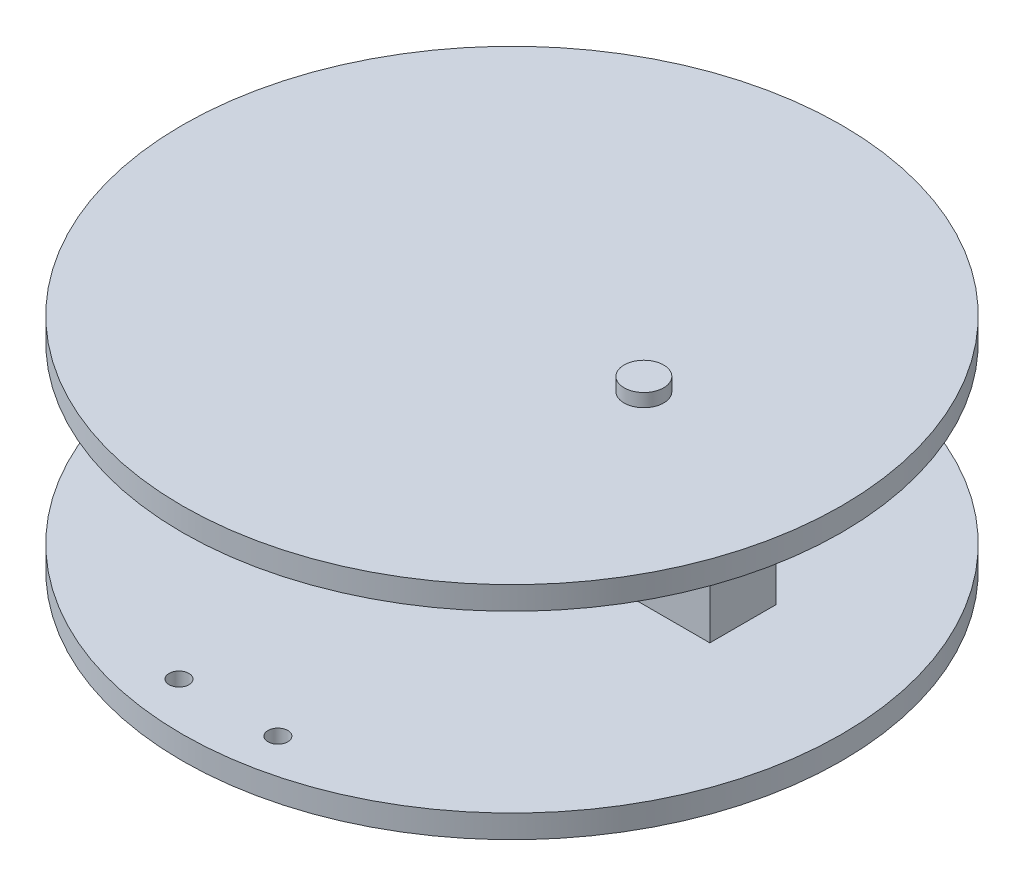
ISO-10303-21;
HEADER;
FILE_DESCRIPTION(('STEP AP214'),'2;1');
FILE_NAME('part.step','',(''),(''),'','','');
FILE_SCHEMA(('AUTOMOTIVE_DESIGN { 1 0 10303 214 1 1 1 1 }'));
ENDSEC;
DATA;
#1=APPLICATION_CONTEXT('core data for automotive mechanical design processes');
#2=APPLICATION_PROTOCOL_DEFINITION('international standard','automotive_design',2000,#1);
#3=PRODUCT_CONTEXT('',#1,'mechanical');
#4=PRODUCT('Part','Part','',(#3));
#5=PRODUCT_RELATED_PRODUCT_CATEGORY('part','',(#4));
#6=PRODUCT_DEFINITION_FORMATION('','',#4);
#7=PRODUCT_DEFINITION_CONTEXT('part definition',#1,'design');
#8=PRODUCT_DEFINITION('design','',#6,#7);
#9=PRODUCT_DEFINITION_SHAPE('','',#8);
#10=(LENGTH_UNIT() NAMED_UNIT(*) SI_UNIT(.MILLI.,.METRE.));
#11=(NAMED_UNIT(*) PLANE_ANGLE_UNIT() SI_UNIT($,.RADIAN.));
#12=(NAMED_UNIT(*) SI_UNIT($,.STERADIAN.) SOLID_ANGLE_UNIT());
#13=UNCERTAINTY_MEASURE_WITH_UNIT(LENGTH_MEASURE(1.E-05),#10,'distance_accuracy_value','');
#14=(GEOMETRIC_REPRESENTATION_CONTEXT(3) GLOBAL_UNCERTAINTY_ASSIGNED_CONTEXT((#13)) GLOBAL_UNIT_ASSIGNED_CONTEXT((#10,
#11,#12)) REPRESENTATION_CONTEXT('',''));
#15=CARTESIAN_POINT('',(0.,0.,0.));
#16=DIRECTION('',(0.,0.,1.));
#17=DIRECTION('',(1.,0.,0.));
#18=AXIS2_PLACEMENT_3D('',#15,#16,#17);
#19=CARTESIAN_POINT('',(35.,20.5,5.));
#20=DIRECTION('',(-1.,0.,0.));
#21=DIRECTION('',(0.,0.,1.));
#22=AXIS2_PLACEMENT_3D('',#19,#20,#21);
#23=PLANE('',#22);
#24=DIRECTION('',(0.,0.,-1.));
#25=VECTOR('',#24,1.);
#26=CARTESIAN_POINT('',(35.,10.5,5.));
#27=LINE('',#26,#25);
#28=CARTESIAN_POINT('',(35.,10.5,5.));
#29=VERTEX_POINT('',#28);
#30=CARTESIAN_POINT('',(35.,10.5,-5.));
#31=VERTEX_POINT('',#30);
#32=EDGE_CURVE('E110',#29,#31,#27,.T.);
#33=ORIENTED_EDGE('',*,*,#32,.T.);
#34=DIRECTION('',(0.,-1.,0.));
#35=VECTOR('',#34,1.);
#36=CARTESIAN_POINT('',(35.,20.5,-5.));
#37=LINE('',#36,#35);
#38=CARTESIAN_POINT('',(35.,20.5,-5.));
#39=VERTEX_POINT('',#38);
#40=EDGE_CURVE('E12',#39,#31,#37,.T.);
#41=ORIENTED_EDGE('',*,*,#40,.F.);
#42=DIRECTION('',(0.,0.,-1.));
#43=VECTOR('',#42,1.);
#44=CARTESIAN_POINT('',(35.,20.5,5.));
#45=LINE('',#44,#43);
#46=CARTESIAN_POINT('',(35.,20.5,5.));
#47=VERTEX_POINT('',#46);
#48=EDGE_CURVE('E98',#47,#39,#45,.T.);
#49=ORIENTED_EDGE('',*,*,#48,.F.);
#50=DIRECTION('',(0.,-1.,0.));
#51=VECTOR('',#50,1.);
#52=CARTESIAN_POINT('',(35.,20.5,5.));
#53=LINE('',#52,#51);
#54=EDGE_CURVE('E106',#47,#29,#53,.T.);
#55=ORIENTED_EDGE('',*,*,#54,.T.);
#56=EDGE_LOOP('',(#33,#41,#49,#55));
#57=FACE_BOUND('',#56,.T.);
#58=ADVANCED_FACE('F47',(#57),#23,.F.);
#59=CARTESIAN_POINT('',(-35.,20.5,-5.));
#60=DIRECTION('',(0.,0.,1.));
#61=DIRECTION('',(1.,0.,0.));
#62=AXIS2_PLACEMENT_3D('',#59,#60,#61);
#63=PLANE('',#62);
#64=DIRECTION('',(-1.,0.,0.));
#65=VECTOR('',#64,1.);
#66=CARTESIAN_POINT('',(-35.,10.5,-5.));
#67=LINE('',#66,#65);
#68=CARTESIAN_POINT('',(-35.,10.5,-5.));
#69=VERTEX_POINT('',#68);
#70=EDGE_CURVE('E102',#31,#69,#67,.T.);
#71=ORIENTED_EDGE('',*,*,#70,.T.);
#72=DIRECTION('',(0.,-1.,0.));
#73=VECTOR('',#72,1.);
#74=CARTESIAN_POINT('',(-35.,20.5,-5.));
#75=LINE('',#74,#73);
#76=CARTESIAN_POINT('',(-35.,20.5,-5.));
#77=VERTEX_POINT('',#76);
#78=EDGE_CURVE('E55',#77,#69,#75,.T.);
#79=ORIENTED_EDGE('',*,*,#78,.F.);
#80=DIRECTION('',(-1.,0.,0.));
#81=VECTOR('',#80,1.);
#82=CARTESIAN_POINT('',(-35.,20.5,-5.));
#83=LINE('',#82,#81);
#84=EDGE_CURVE('E93',#39,#77,#83,.T.);
#85=ORIENTED_EDGE('',*,*,#84,.F.);
#86=ORIENTED_EDGE('',*,*,#40,.T.);
#87=EDGE_LOOP('',(#71,#79,#85,#86));
#88=FACE_BOUND('',#87,.T.);
#89=ADVANCED_FACE('F101',(#88),#63,.F.);
#90=CARTESIAN_POINT('',(-35.,20.5,5.));
#91=DIRECTION('',(1.,0.,0.));
#92=DIRECTION('',(0.,0.,-1.));
#93=AXIS2_PLACEMENT_3D('',#90,#91,#92);
#94=PLANE('',#93);
#95=DIRECTION('',(0.,0.,1.));
#96=VECTOR('',#95,1.);
#97=CARTESIAN_POINT('',(-35.,10.5,5.));
#98=LINE('',#97,#96);
#99=CARTESIAN_POINT('',(-35.,10.5,5.));
#100=VERTEX_POINT('',#99);
#101=EDGE_CURVE('E80',#69,#100,#98,.T.);
#102=ORIENTED_EDGE('',*,*,#101,.T.);
#103=DIRECTION('',(0.,-1.,0.));
#104=VECTOR('',#103,1.);
#105=CARTESIAN_POINT('',(-35.,20.5,5.));
#106=LINE('',#105,#104);
#107=CARTESIAN_POINT('',(-35.,20.5,5.));
#108=VERTEX_POINT('',#107);
#109=EDGE_CURVE('E103',#108,#100,#106,.T.);
#110=ORIENTED_EDGE('',*,*,#109,.F.);
#111=DIRECTION('',(0.,0.,1.));
#112=VECTOR('',#111,1.);
#113=CARTESIAN_POINT('',(-35.,20.5,5.));
#114=LINE('',#113,#112);
#115=EDGE_CURVE('E96',#77,#108,#114,.T.);
#116=ORIENTED_EDGE('',*,*,#115,.F.);
#117=ORIENTED_EDGE('',*,*,#78,.T.);
#118=EDGE_LOOP('',(#102,#110,#116,#117));
#119=FACE_BOUND('',#118,.T.);
#120=ADVANCED_FACE('F104',(#119),#94,.F.);
#121=CARTESIAN_POINT('',(-35.,20.5,5.));
#122=DIRECTION('',(0.,0.,-1.));
#123=DIRECTION('',(-1.,0.,0.));
#124=AXIS2_PLACEMENT_3D('',#121,#122,#123);
#125=PLANE('',#124);
#126=DIRECTION('',(1.,0.,0.));
#127=VECTOR('',#126,1.);
#128=CARTESIAN_POINT('',(-35.,10.5,5.));
#129=LINE('',#128,#127);
#130=EDGE_CURVE('E86',#100,#29,#129,.T.);
#131=ORIENTED_EDGE('',*,*,#130,.T.);
#132=ORIENTED_EDGE('',*,*,#54,.F.);
#133=DIRECTION('',(1.,0.,0.));
#134=VECTOR('',#133,1.);
#135=CARTESIAN_POINT('',(-35.,20.5,5.));
#136=LINE('',#135,#134);
#137=EDGE_CURVE('E63',#108,#47,#136,.T.);
#138=ORIENTED_EDGE('',*,*,#137,.F.);
#139=ORIENTED_EDGE('',*,*,#109,.T.);
#140=EDGE_LOOP('',(#131,#132,#138,#139));
#141=FACE_BOUND('',#140,.T.);
#142=ADVANCED_FACE('F117',(#141),#125,.F.);
#143=CARTESIAN_POINT('',(0.,20.5,0.));
#144=DIRECTION('',(0.,-1.,0.));
#145=DIRECTION('',(0.,0.,-1.));
#146=AXIS2_PLACEMENT_3D('',#143,#144,#145);
#147=PLANE('',#146);
#148=ORIENTED_EDGE('',*,*,#48,.T.);
#149=ORIENTED_EDGE('',*,*,#84,.T.);
#150=ORIENTED_EDGE('',*,*,#115,.T.);
#151=ORIENTED_EDGE('',*,*,#137,.T.);
#152=EDGE_LOOP('',(#148,#149,#150,#151));
#153=FACE_BOUND('',#152,.T.);
#154=ADVANCED_FACE('F94',(#153),#147,.F.);
#155=CARTESIAN_POINT('',(0.,10.5,0.));
#156=DIRECTION('',(0.,-1.,0.));
#157=DIRECTION('',(0.,0.,-1.));
#158=AXIS2_PLACEMENT_3D('',#155,#156,#157);
#159=PLANE('',#158);
#160=ORIENTED_EDGE('',*,*,#32,.F.);
#161=ORIENTED_EDGE('',*,*,#130,.F.);
#162=ORIENTED_EDGE('',*,*,#101,.F.);
#163=ORIENTED_EDGE('',*,*,#70,.F.);
#164=EDGE_LOOP('',(#160,#161,#162,#163));
#165=FACE_BOUND('',#164,.T.);
#166=ADVANCED_FACE('F120',(#165),#159,.T.);
#167=CLOSED_SHELL('',(#58,#89,#120,#142,#154,#166));
#168=MANIFOLD_SOLID_BREP('B2',#167);
#169=CARTESIAN_POINT('',(0.,33.5,0.));
#170=DIRECTION('',(0.,-1.,0.));
#171=DIRECTION('',(0.,0.,-1.));
#172=AXIS2_PLACEMENT_3D('',#169,#170,#171);
#173=CYLINDRICAL_SURFACE('',#172,50.);
#174=CARTESIAN_POINT('',(0.,33.5,0.));
#175=DIRECTION('',(0.,1.,0.));
#176=DIRECTION('',(0.,0.,1.));
#177=AXIS2_PLACEMENT_3D('',#174,#175,#176);
#178=CIRCLE('',#177,50.);
#179=CARTESIAN_POINT('',(0.,33.5,50.));
#180=VERTEX_POINT('',#179);
#181=EDGE_CURVE('E46',#180,#180,#178,.T.);
#182=ORIENTED_EDGE('',*,*,#181,.F.);
#183=EDGE_LOOP('',(#182));
#184=FACE_BOUND('',#183,.T.);
#185=CARTESIAN_POINT('',(0.,30.,0.));
#186=DIRECTION('',(0.,1.,0.));
#187=DIRECTION('',(0.,0.,1.));
#188=AXIS2_PLACEMENT_3D('',#185,#186,#187);
#189=CIRCLE('',#188,50.);
#190=CARTESIAN_POINT('',(0.,30.,50.));
#191=VERTEX_POINT('',#190);
#192=EDGE_CURVE('E181',#191,#191,#189,.T.);
#193=ORIENTED_EDGE('',*,*,#192,.T.);
#194=EDGE_LOOP('',(#193));
#195=FACE_BOUND('',#194,.T.);
#196=ADVANCED_FACE('F178',(#184,#195),#173,.T.);
#197=CARTESIAN_POINT('',(0.,33.5,0.));
#198=DIRECTION('',(0.,1.,0.));
#199=DIRECTION('',(0.,0.,1.));
#200=AXIS2_PLACEMENT_3D('',#197,#198,#199);
#201=PLANE('',#200);
#202=CARTESIAN_POINT('',(20.,33.5,0.));
#203=DIRECTION('',(0.,1.,0.));
#204=DIRECTION('',(0.,0.,1.));
#205=AXIS2_PLACEMENT_3D('',#202,#203,#204);
#206=CIRCLE('',#205,3.);
#207=CARTESIAN_POINT('',(20.,33.5,3.));
#208=VERTEX_POINT('',#207);
#209=EDGE_CURVE('E190',#208,#208,#206,.T.);
#210=ORIENTED_EDGE('',*,*,#209,.F.);
#211=EDGE_LOOP('',(#210));
#212=FACE_BOUND('',#211,.T.);
#213=ORIENTED_EDGE('',*,*,#181,.T.);
#214=EDGE_LOOP('',(#213));
#215=FACE_BOUND('',#214,.T.);
#216=ADVANCED_FACE('F205',(#212,#215),#201,.T.);
#217=CARTESIAN_POINT('',(0.,30.,0.));
#218=DIRECTION('',(0.,1.,0.));
#219=DIRECTION('',(0.,0.,1.));
#220=AXIS2_PLACEMENT_3D('',#217,#218,#219);
#221=PLANE('',#220);
#222=ORIENTED_EDGE('',*,*,#192,.F.);
#223=EDGE_LOOP('',(#222));
#224=FACE_BOUND('',#223,.T.);
#225=ADVANCED_FACE('F201',(#224),#221,.F.);
#226=CARTESIAN_POINT('',(20.,35.5,0.));
#227=DIRECTION('',(0.,-1.,0.));
#228=DIRECTION('',(0.,0.,-1.));
#229=AXIS2_PLACEMENT_3D('',#226,#227,#228);
#230=CYLINDRICAL_SURFACE('',#229,3.);
#231=CARTESIAN_POINT('',(20.,35.5,0.));
#232=DIRECTION('',(0.,1.,0.));
#233=DIRECTION('',(0.,0.,1.));
#234=AXIS2_PLACEMENT_3D('',#231,#232,#233);
#235=CIRCLE('',#234,3.);
#236=CARTESIAN_POINT('',(20.,35.5,3.));
#237=VERTEX_POINT('',#236);
#238=EDGE_CURVE('E188',#237,#237,#235,.T.);
#239=ORIENTED_EDGE('',*,*,#238,.F.);
#240=EDGE_LOOP('',(#239));
#241=FACE_BOUND('',#240,.T.);
#242=ORIENTED_EDGE('',*,*,#209,.T.);
#243=EDGE_LOOP('',(#242));
#244=FACE_BOUND('',#243,.T.);
#245=ADVANCED_FACE('F198',(#241,#244),#230,.T.);
#246=CARTESIAN_POINT('',(20.,35.5,0.));
#247=DIRECTION('',(0.,1.,0.));
#248=DIRECTION('',(0.,0.,1.));
#249=AXIS2_PLACEMENT_3D('',#246,#247,#248);
#250=PLANE('',#249);
#251=ORIENTED_EDGE('',*,*,#238,.T.);
#252=EDGE_LOOP('',(#251));
#253=FACE_BOUND('',#252,.T.);
#254=ADVANCED_FACE('F196',(#253),#250,.T.);
#255=CLOSED_SHELL('',(#196,#216,#225,#245,#254));
#256=MANIFOLD_SOLID_BREP('B6',#255);
#257=CARTESIAN_POINT('',(0.,3.5,0.));
#258=DIRECTION('',(0.,-1.,0.));
#259=DIRECTION('',(0.,0.,-1.));
#260=AXIS2_PLACEMENT_3D('',#257,#258,#259);
#261=CYLINDRICAL_SURFACE('',#260,50.);
#262=CARTESIAN_POINT('',(0.,3.5,0.));
#263=DIRECTION('',(0.,1.,0.));
#264=DIRECTION('',(0.,0.,1.));
#265=AXIS2_PLACEMENT_3D('',#262,#263,#264);
#266=CIRCLE('',#265,50.);
#267=CARTESIAN_POINT('',(0.,3.5,50.));
#268=VERTEX_POINT('',#267);
#269=EDGE_CURVE('E263',#268,#268,#266,.T.);
#270=ORIENTED_EDGE('',*,*,#269,.F.);
#271=EDGE_LOOP('',(#270));
#272=FACE_BOUND('',#271,.T.);
#273=CARTESIAN_POINT('',(0.,0.,0.));
#274=DIRECTION('',(0.,1.,0.));
#275=DIRECTION('',(0.,0.,1.));
#276=AXIS2_PLACEMENT_3D('',#273,#274,#275);
#277=CIRCLE('',#276,50.);
#278=CARTESIAN_POINT('',(0.,0.,50.));
#279=VERTEX_POINT('',#278);
#280=EDGE_CURVE('E266',#279,#279,#277,.T.);
#281=ORIENTED_EDGE('',*,*,#280,.T.);
#282=EDGE_LOOP('',(#281));
#283=FACE_BOUND('',#282,.T.);
#284=ADVANCED_FACE('F249',(#272,#283),#261,.T.);
#285=CARTESIAN_POINT('',(0.,3.5,0.));
#286=DIRECTION('',(0.,1.,0.));
#287=DIRECTION('',(0.,0.,1.));
#288=AXIS2_PLACEMENT_3D('',#285,#286,#287);
#289=PLANE('',#288);
#290=CARTESIAN_POINT('',(-7.49999999999999,3.5,43.));
#291=DIRECTION('',(0.,1.,0.));
#292=DIRECTION('',(0.,0.,1.));
#293=AXIS2_PLACEMENT_3D('',#290,#291,#292);
#294=CIRCLE('',#293,1.5);
#295=CARTESIAN_POINT('',(-7.49999999999999,3.5,44.5));
#296=VERTEX_POINT('',#295);
#297=EDGE_CURVE('E279',#296,#296,#294,.T.);
#298=ORIENTED_EDGE('',*,*,#297,.F.);
#299=EDGE_LOOP('',(#298));
#300=FACE_BOUND('',#299,.T.);
#301=CARTESIAN_POINT('',(7.50000000000001,3.5,43.));
#302=DIRECTION('',(0.,1.,0.));
#303=DIRECTION('',(0.,0.,-1.));
#304=AXIS2_PLACEMENT_3D('',#301,#302,#303);
#305=CIRCLE('',#304,1.5);
#306=CARTESIAN_POINT('',(7.50000000000001,3.5,41.5));
#307=VERTEX_POINT('',#306);
#308=EDGE_CURVE('E272',#307,#307,#305,.T.);
#309=ORIENTED_EDGE('',*,*,#308,.F.);
#310=EDGE_LOOP('',(#309));
#311=FACE_BOUND('',#310,.T.);
#312=ORIENTED_EDGE('',*,*,#269,.T.);
#313=EDGE_LOOP('',(#312));
#314=FACE_BOUND('',#313,.T.);
#315=ADVANCED_FACE('F308',(#300,#311,#314),#289,.T.);
#316=CARTESIAN_POINT('',(0.,0.,0.));
#317=DIRECTION('',(0.,1.,0.));
#318=DIRECTION('',(0.,0.,1.));
#319=AXIS2_PLACEMENT_3D('',#316,#317,#318);
#320=PLANE('',#319);
#321=CARTESIAN_POINT('',(33.7749907475933,0.,19.4999999999997));
#322=DIRECTION('',(0.,1.,0.));
#323=DIRECTION('',(0.,0.,1.));
#324=AXIS2_PLACEMENT_3D('',#321,#322,#323);
#325=CIRCLE('',#324,3.);
#326=CARTESIAN_POINT('',(33.7749907475933,0.,22.4999999999997));
#327=VERTEX_POINT('',#326);
#328=EDGE_CURVE('E177',#327,#327,#325,.F.);
#329=ORIENTED_EDGE('',*,*,#328,.F.);
#330=EDGE_LOOP('',(#329));
#331=FACE_BOUND('',#330,.T.);
#332=CARTESIAN_POINT('',(-33.774990747593,0.,19.5000000000002));
#333=DIRECTION('',(0.,1.,0.));
#334=DIRECTION('',(0.,0.,1.));
#335=AXIS2_PLACEMENT_3D('',#332,#333,#334);
#336=CIRCLE('',#335,3.);
#337=CARTESIAN_POINT('',(-33.774990747593,0.,22.5000000000002));
#338=VERTEX_POINT('',#337);
#339=EDGE_CURVE('E255',#338,#338,#336,.F.);
#340=ORIENTED_EDGE('',*,*,#339,.F.);
#341=EDGE_LOOP('',(#340));
#342=FACE_BOUND('',#341,.T.);
#343=CARTESIAN_POINT('',(0.,0.,-39.));
#344=DIRECTION('',(0.,1.,0.));
#345=DIRECTION('',(0.,0.,1.));
#346=AXIS2_PLACEMENT_3D('',#343,#344,#345);
#347=CIRCLE('',#346,3.);
#348=CARTESIAN_POINT('',(0.,0.,-36.));
#349=VERTEX_POINT('',#348);
#350=EDGE_CURVE('E259',#349,#349,#347,.F.);
#351=ORIENTED_EDGE('',*,*,#350,.F.);
#352=EDGE_LOOP('',(#351));
#353=FACE_BOUND('',#352,.T.);
#354=CARTESIAN_POINT('',(-7.49999999999999,0.,43.));
#355=DIRECTION('',(0.,1.,0.));
#356=DIRECTION('',(0.,0.,1.));
#357=AXIS2_PLACEMENT_3D('',#354,#355,#356);
#358=CIRCLE('',#357,1.5);
#359=CARTESIAN_POINT('',(-7.49999999999999,0.,44.5));
#360=VERTEX_POINT('',#359);
#361=EDGE_CURVE('E269',#360,#360,#358,.T.);
#362=ORIENTED_EDGE('',*,*,#361,.T.);
#363=EDGE_LOOP('',(#362));
#364=FACE_BOUND('',#363,.T.);
#365=CARTESIAN_POINT('',(7.50000000000001,0.,43.));
#366=DIRECTION('',(0.,1.,0.));
#367=DIRECTION('',(0.,0.,-1.));
#368=AXIS2_PLACEMENT_3D('',#365,#366,#367);
#369=CIRCLE('',#368,1.5);
#370=CARTESIAN_POINT('',(7.50000000000001,0.,41.5));
#371=VERTEX_POINT('',#370);
#372=EDGE_CURVE('E275',#371,#371,#369,.T.);
#373=ORIENTED_EDGE('',*,*,#372,.T.);
#374=EDGE_LOOP('',(#373));
#375=FACE_BOUND('',#374,.T.);
#376=ORIENTED_EDGE('',*,*,#280,.F.);
#377=EDGE_LOOP('',(#376));
#378=FACE_BOUND('',#377,.T.);
#379=ADVANCED_FACE('F314',(#331,#342,#353,#364,#375,#378),#320,.F.);
#380=CARTESIAN_POINT('',(7.50000000000001,0.,43.));
#381=DIRECTION('',(0.,1.,0.));
#382=DIRECTION('',(0.,0.,1.));
#383=AXIS2_PLACEMENT_3D('',#380,#381,#382);
#384=CYLINDRICAL_SURFACE('',#383,1.5);
#385=ORIENTED_EDGE('',*,*,#372,.F.);
#386=EDGE_LOOP('',(#385));
#387=FACE_BOUND('',#386,.T.);
#388=ORIENTED_EDGE('',*,*,#308,.T.);
#389=EDGE_LOOP('',(#388));
#390=FACE_BOUND('',#389,.T.);
#391=ADVANCED_FACE('F322',(#387,#390),#384,.F.);
#392=CARTESIAN_POINT('',(-7.49999999999999,0.,43.));
#393=DIRECTION('',(0.,1.,0.));
#394=DIRECTION('',(0.,0.,1.));
#395=AXIS2_PLACEMENT_3D('',#392,#393,#394);
#396=CYLINDRICAL_SURFACE('',#395,1.5);
#397=ORIENTED_EDGE('',*,*,#361,.F.);
#398=EDGE_LOOP('',(#397));
#399=FACE_BOUND('',#398,.T.);
#400=ORIENTED_EDGE('',*,*,#297,.T.);
#401=EDGE_LOOP('',(#400));
#402=FACE_BOUND('',#401,.T.);
#403=ADVANCED_FACE('F329',(#399,#402),#396,.F.);
#404=CARTESIAN_POINT('',(0.,-3.,-39.));
#405=DIRECTION('',(0.,1.,0.));
#406=DIRECTION('',(0.,0.,1.));
#407=AXIS2_PLACEMENT_3D('',#404,#405,#406);
#408=CYLINDRICAL_SURFACE('',#407,3.);
#409=CARTESIAN_POINT('',(0.,-3.,-39.));
#410=DIRECTION('',(0.,-1.,0.));
#411=DIRECTION('',(0.,0.,-1.));
#412=AXIS2_PLACEMENT_3D('',#409,#410,#411);
#413=CIRCLE('',#412,3.);
#414=CARTESIAN_POINT('',(0.,-3.,-42.));
#415=VERTEX_POINT('',#414);
#416=EDGE_CURVE('E276',#415,#415,#413,.T.);
#417=ORIENTED_EDGE('',*,*,#416,.F.);
#418=EDGE_LOOP('',(#417));
#419=FACE_BOUND('',#418,.T.);
#420=ORIENTED_EDGE('',*,*,#350,.T.);
#421=EDGE_LOOP('',(#420));
#422=FACE_BOUND('',#421,.T.);
#423=ADVANCED_FACE('F336',(#419,#422),#408,.T.);
#424=CARTESIAN_POINT('',(0.,-3.,-39.));
#425=DIRECTION('',(0.,-1.,0.));
#426=DIRECTION('',(0.,0.,-1.));
#427=AXIS2_PLACEMENT_3D('',#424,#425,#426);
#428=PLANE('',#427);
#429=ORIENTED_EDGE('',*,*,#416,.T.);
#430=EDGE_LOOP('',(#429));
#431=FACE_BOUND('',#430,.T.);
#432=ADVANCED_FACE('F340',(#431),#428,.T.);
#433=CARTESIAN_POINT('',(-33.774990747593,-3.,19.5000000000002));
#434=DIRECTION('',(0.,1.,0.));
#435=DIRECTION('',(0.,0.,1.));
#436=AXIS2_PLACEMENT_3D('',#433,#434,#435);
#437=CYLINDRICAL_SURFACE('',#436,3.);
#438=CARTESIAN_POINT('',(-33.774990747593,-3.,19.5000000000002));
#439=DIRECTION('',(0.,-1.,0.));
#440=DIRECTION('',(0.,0.,-1.));
#441=AXIS2_PLACEMENT_3D('',#438,#439,#440);
#442=CIRCLE('',#441,3.);
#443=CARTESIAN_POINT('',(-33.774990747593,-3.,16.5000000000002));
#444=VERTEX_POINT('',#443);
#445=EDGE_CURVE('E286',#444,#444,#442,.T.);
#446=ORIENTED_EDGE('',*,*,#445,.F.);
#447=EDGE_LOOP('',(#446));
#448=FACE_BOUND('',#447,.T.);
#449=ORIENTED_EDGE('',*,*,#339,.T.);
#450=EDGE_LOOP('',(#449));
#451=FACE_BOUND('',#450,.T.);
#452=ADVANCED_FACE('F304',(#448,#451),#437,.T.);
#453=CARTESIAN_POINT('',(-33.774990747593,-3.,19.5000000000002));
#454=DIRECTION('',(0.,-1.,0.));
#455=DIRECTION('',(0.,0.,-1.));
#456=AXIS2_PLACEMENT_3D('',#453,#454,#455);
#457=PLANE('',#456);
#458=ORIENTED_EDGE('',*,*,#445,.T.);
#459=EDGE_LOOP('',(#458));
#460=FACE_BOUND('',#459,.T.);
#461=ADVANCED_FACE('F297',(#460),#457,.T.);
#462=CARTESIAN_POINT('',(33.7749907475933,-3.,19.4999999999997));
#463=DIRECTION('',(0.,1.,0.));
#464=DIRECTION('',(0.,0.,1.));
#465=AXIS2_PLACEMENT_3D('',#462,#463,#464);
#466=CYLINDRICAL_SURFACE('',#465,3.);
#467=CARTESIAN_POINT('',(33.7749907475933,-3.,19.4999999999997));
#468=DIRECTION('',(0.,-1.,0.));
#469=DIRECTION('',(0.,0.,-1.));
#470=AXIS2_PLACEMENT_3D('',#467,#468,#469);
#471=CIRCLE('',#470,3.);
#472=CARTESIAN_POINT('',(33.7749907475933,-3.,16.4999999999997));
#473=VERTEX_POINT('',#472);
#474=EDGE_CURVE('E289',#473,#473,#471,.T.);
#475=ORIENTED_EDGE('',*,*,#474,.F.);
#476=EDGE_LOOP('',(#475));
#477=FACE_BOUND('',#476,.T.);
#478=ORIENTED_EDGE('',*,*,#328,.T.);
#479=EDGE_LOOP('',(#478));
#480=FACE_BOUND('',#479,.T.);
#481=ADVANCED_FACE('F295',(#477,#480),#466,.T.);
#482=CARTESIAN_POINT('',(33.7749907475933,-3.,19.4999999999997));
#483=DIRECTION('',(0.,-1.,0.));
#484=DIRECTION('',(0.,0.,-1.));
#485=AXIS2_PLACEMENT_3D('',#482,#483,#484);
#486=PLANE('',#485);
#487=ORIENTED_EDGE('',*,*,#474,.T.);
#488=EDGE_LOOP('',(#487));
#489=FACE_BOUND('',#488,.T.);
#490=ADVANCED_FACE('F293',(#489),#486,.T.);
#491=CLOSED_SHELL('',(#284,#315,#379,#391,#403,#423,#432,#452,#461,#481,#490));
#492=MANIFOLD_SOLID_BREP('B41',#491);
#493=ADVANCED_BREP_SHAPE_REPRESENTATION('',(#18,#168,#256,#492),#14);
#494=SHAPE_DEFINITION_REPRESENTATION(#9,#493);
ENDSEC;
END-ISO-10303-21;
